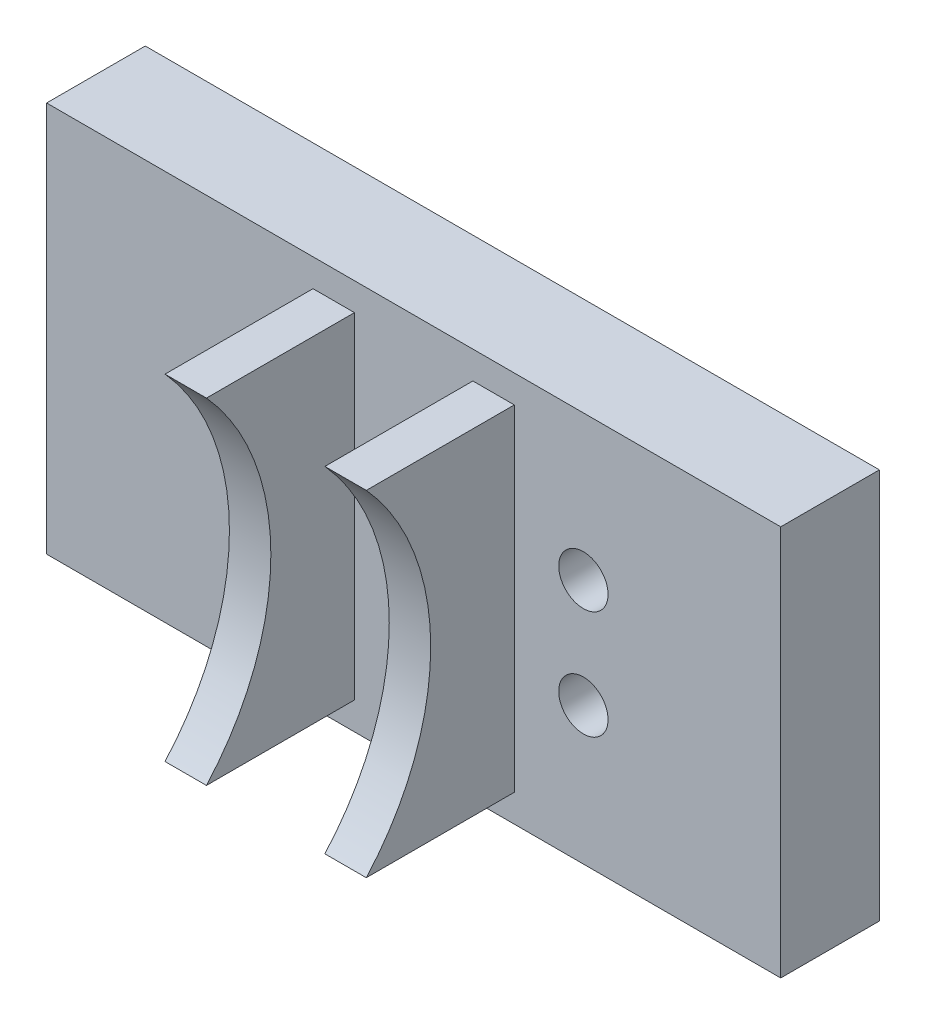
ISO-10303-21;
HEADER;
FILE_DESCRIPTION(('STEP AP214'),'2;1');
FILE_NAME('part.step','',(''),(''),'','','');
FILE_SCHEMA(('AUTOMOTIVE_DESIGN { 1 0 10303 214 1 1 1 1 }'));
ENDSEC;
DATA;
#1=APPLICATION_CONTEXT('core data for automotive mechanical design processes');
#2=APPLICATION_PROTOCOL_DEFINITION('international standard','automotive_design',2000,#1);
#3=PRODUCT_CONTEXT('',#1,'mechanical');
#4=PRODUCT('Part','Part','',(#3));
#5=PRODUCT_RELATED_PRODUCT_CATEGORY('part','',(#4));
#6=PRODUCT_DEFINITION_FORMATION('','',#4);
#7=PRODUCT_DEFINITION_CONTEXT('part definition',#1,'design');
#8=PRODUCT_DEFINITION('design','',#6,#7);
#9=PRODUCT_DEFINITION_SHAPE('','',#8);
#10=(LENGTH_UNIT() NAMED_UNIT(*) SI_UNIT(.MILLI.,.METRE.));
#11=(NAMED_UNIT(*) PLANE_ANGLE_UNIT() SI_UNIT($,.RADIAN.));
#12=(NAMED_UNIT(*) SI_UNIT($,.STERADIAN.) SOLID_ANGLE_UNIT());
#13=UNCERTAINTY_MEASURE_WITH_UNIT(LENGTH_MEASURE(1.E-05),#10,'distance_accuracy_value','');
#14=(GEOMETRIC_REPRESENTATION_CONTEXT(3) GLOBAL_UNCERTAINTY_ASSIGNED_CONTEXT((#13)) GLOBAL_UNIT_ASSIGNED_CONTEXT((#10,
#11,#12)) REPRESENTATION_CONTEXT('',''));
#15=CARTESIAN_POINT('',(0.,0.,0.));
#16=DIRECTION('',(0.,0.,1.));
#17=DIRECTION('',(1.,0.,0.));
#18=AXIS2_PLACEMENT_3D('',#15,#16,#17);
#19=CARTESIAN_POINT('',(-69.9912890625,-22.80271484375,25.));
#20=DIRECTION('',(1.,0.,0.));
#21=DIRECTION('',(0.,0.,-1.));
#22=AXIS2_PLACEMENT_3D('',#19,#20,#21);
#23=PLANE('',#22);
#24=CARTESIAN_POINT('',(-69.9912890625,-5.80271484375,43.8722017793367));
#25=DIRECTION('',(1.,0.,0.));
#26=DIRECTION('',(0.,0.,-1.));
#27=AXIS2_PLACEMENT_3D('',#24,#25,#26);
#28=CIRCLE('',#27,25.4);
#29=CARTESIAN_POINT('',(-69.9912890625,11.19728515625,25.));
#30=VERTEX_POINT('',#29);
#31=CARTESIAN_POINT('',(-69.9912890625,-22.80271484375,25.));
#32=VERTEX_POINT('',#31);
#33=EDGE_CURVE('E137',#30,#32,#28,.F.);
#34=ORIENTED_EDGE('',*,*,#33,.F.);
#35=DIRECTION('',(0.,0.,-1.));
#36=VECTOR('',#35,1.);
#37=CARTESIAN_POINT('',(-69.9912890625,11.19728515625,25.));
#38=LINE('',#37,#36);
#39=CARTESIAN_POINT('',(-69.9912890625,11.19728515625,10.));
#40=VERTEX_POINT('',#39);
#41=EDGE_CURVE('E123',#30,#40,#38,.T.);
#42=ORIENTED_EDGE('',*,*,#41,.T.);
#43=DIRECTION('',(0.,-1.,0.));
#44=VECTOR('',#43,1.);
#45=CARTESIAN_POINT('',(-69.9912890625,-22.80271484375,10.));
#46=LINE('',#45,#44);
#47=CARTESIAN_POINT('',(-69.9912890625,-22.80271484375,10.));
#48=VERTEX_POINT('',#47);
#49=EDGE_CURVE('E151',#40,#48,#46,.T.);
#50=ORIENTED_EDGE('',*,*,#49,.T.);
#51=DIRECTION('',(0.,0.,-1.));
#52=VECTOR('',#51,1.);
#53=CARTESIAN_POINT('',(-69.9912890625,-22.80271484375,25.));
#54=LINE('',#53,#52);
#55=EDGE_CURVE('E139',#32,#48,#54,.T.);
#56=ORIENTED_EDGE('',*,*,#55,.F.);
#57=EDGE_LOOP('',(#34,#42,#50,#56));
#58=FACE_BOUND('',#57,.T.);
#59=ADVANCED_FACE('F33',(#58),#23,.F.);
#60=CARTESIAN_POINT('',(-65.7912890625,-22.80271484375,25.));
#61=DIRECTION('',(-1.,0.,0.));
#62=DIRECTION('',(0.,0.,1.));
#63=AXIS2_PLACEMENT_3D('',#60,#61,#62);
#64=PLANE('',#63);
#65=CARTESIAN_POINT('',(-65.7912890625,-5.80271484375,43.8722017793367));
#66=DIRECTION('',(-1.,0.,0.));
#67=DIRECTION('',(0.,0.,1.));
#68=AXIS2_PLACEMENT_3D('',#65,#66,#67);
#69=CIRCLE('',#68,25.4);
#70=CARTESIAN_POINT('',(-65.7912890625,11.19728515625,25.));
#71=VERTEX_POINT('',#70);
#72=CARTESIAN_POINT('',(-65.7912890625,-22.80271484375,25.));
#73=VERTEX_POINT('',#72);
#74=EDGE_CURVE('E143',#71,#73,#69,.T.);
#75=ORIENTED_EDGE('',*,*,#74,.T.);
#76=DIRECTION('',(0.,0.,-1.));
#77=VECTOR('',#76,1.);
#78=CARTESIAN_POINT('',(-65.7912890625,-22.80271484375,25.));
#79=LINE('',#78,#77);
#80=CARTESIAN_POINT('',(-65.7912890625,-22.80271484375,10.));
#81=VERTEX_POINT('',#80);
#82=EDGE_CURVE('E162',#73,#81,#79,.T.);
#83=ORIENTED_EDGE('',*,*,#82,.T.);
#84=DIRECTION('',(0.,1.,0.));
#85=VECTOR('',#84,1.);
#86=CARTESIAN_POINT('',(-65.7912890625,-22.80271484375,10.));
#87=LINE('',#86,#85);
#88=CARTESIAN_POINT('',(-65.7912890625,11.19728515625,10.));
#89=VERTEX_POINT('',#88);
#90=EDGE_CURVE('E157',#81,#89,#87,.T.);
#91=ORIENTED_EDGE('',*,*,#90,.T.);
#92=DIRECTION('',(0.,0.,-1.));
#93=VECTOR('',#92,1.);
#94=CARTESIAN_POINT('',(-65.7912890625,11.19728515625,25.));
#95=LINE('',#94,#93);
#96=EDGE_CURVE('E133',#71,#89,#95,.T.);
#97=ORIENTED_EDGE('',*,*,#96,.F.);
#98=EDGE_LOOP('',(#75,#83,#91,#97));
#99=FACE_BOUND('',#98,.T.);
#100=ADVANCED_FACE('F263',(#99),#64,.F.);
#101=CARTESIAN_POINT('',(0.,0.,10.));
#102=DIRECTION('',(0.,0.,-1.));
#103=DIRECTION('',(-1.,0.,0.));
#104=AXIS2_PLACEMENT_3D('',#101,#102,#103);
#105=PLANE('',#104);
#106=CARTESIAN_POINT('',(-76.0087125308004,-11.68271484375,10.));
#107=DIRECTION('',(0.,0.,1.));
#108=DIRECTION('',(1.,0.,0.));
#109=AXIS2_PLACEMENT_3D('',#106,#107,#108);
#110=CIRCLE('',#109,2.5);
#111=CARTESIAN_POINT('',(-73.5087125308004,-11.68271484375,10.));
#112=VERTEX_POINT('',#111);
#113=EDGE_CURVE('E387',#112,#112,#110,.T.);
#114=ORIENTED_EDGE('',*,*,#113,.F.);
#115=EDGE_LOOP('',(#114));
#116=FACE_BOUND('',#115,.T.);
#117=CARTESIAN_POINT('',(-42.5912890625,-0.682714843749998,10.));
#118=DIRECTION('',(0.,0.,1.));
#119=DIRECTION('',(1.,0.,0.));
#120=AXIS2_PLACEMENT_3D('',#117,#118,#119);
#121=CIRCLE('',#120,2.5);
#122=CARTESIAN_POINT('',(-40.0912890625,-0.682714843749998,10.));
#123=VERTEX_POINT('',#122);
#124=EDGE_CURVE('E388',#123,#123,#121,.T.);
#125=ORIENTED_EDGE('',*,*,#124,.F.);
#126=EDGE_LOOP('',(#125));
#127=FACE_BOUND('',#126,.T.);
#128=CARTESIAN_POINT('',(-76.0087125308004,-0.682714843749998,10.));
#129=DIRECTION('',(0.,0.,1.));
#130=DIRECTION('',(1.,0.,0.));
#131=AXIS2_PLACEMENT_3D('',#128,#129,#130);
#132=CIRCLE('',#131,2.5);
#133=CARTESIAN_POINT('',(-73.5087125308004,-0.682714843749998,10.));
#134=VERTEX_POINT('',#133);
#135=EDGE_CURVE('E390',#134,#134,#132,.T.);
#136=ORIENTED_EDGE('',*,*,#135,.F.);
#137=EDGE_LOOP('',(#136));
#138=FACE_BOUND('',#137,.T.);
#139=CARTESIAN_POINT('',(-42.5912890625,-11.68271484375,10.));
#140=DIRECTION('',(0.,0.,1.));
#141=DIRECTION('',(1.,0.,0.));
#142=AXIS2_PLACEMENT_3D('',#139,#140,#141);
#143=CIRCLE('',#142,2.5);
#144=CARTESIAN_POINT('',(-40.0912890625,-11.68271484375,10.));
#145=VERTEX_POINT('',#144);
#146=EDGE_CURVE('E196',#145,#145,#143,.T.);
#147=ORIENTED_EDGE('',*,*,#146,.F.);
#148=EDGE_LOOP('',(#147));
#149=FACE_BOUND('',#148,.T.);
#150=ORIENTED_EDGE('',*,*,#49,.F.);
#151=DIRECTION('',(-1.,0.,0.));
#152=VECTOR('',#151,1.);
#153=CARTESIAN_POINT('',(-69.9912890625,11.19728515625,10.));
#154=LINE('',#153,#152);
#155=EDGE_CURVE('E130',#89,#40,#154,.T.);
#156=ORIENTED_EDGE('',*,*,#155,.F.);
#157=ORIENTED_EDGE('',*,*,#90,.F.);
#158=DIRECTION('',(1.,0.,0.));
#159=VECTOR('',#158,1.);
#160=CARTESIAN_POINT('',(-69.9912890625,-22.80271484375,10.));
#161=LINE('',#160,#159);
#162=EDGE_CURVE('E153',#48,#81,#161,.T.);
#163=ORIENTED_EDGE('',*,*,#162,.F.);
#164=EDGE_LOOP('',(#150,#156,#157,#163));
#165=FACE_BOUND('',#164,.T.);
#166=DIRECTION('',(0.,1.,0.));
#167=VECTOR('',#166,1.);
#168=CARTESIAN_POINT('',(-22.5912890625,13.99728515625,10.));
#169=LINE('',#168,#167);
#170=CARTESIAN_POINT('',(-22.5912890625,-25.60271484375,10.));
#171=VERTEX_POINT('',#170);
#172=CARTESIAN_POINT('',(-22.5912890625,13.99728515625,10.));
#173=VERTEX_POINT('',#172);
#174=EDGE_CURVE('E167',#171,#173,#169,.T.);
#175=ORIENTED_EDGE('',*,*,#174,.T.);
#176=DIRECTION('',(-1.,0.,0.));
#177=VECTOR('',#176,1.);
#178=CARTESIAN_POINT('',(-22.5912890625,13.99728515625,10.));
#179=LINE('',#178,#177);
#180=CARTESIAN_POINT('',(-96.9912890625,13.99728515625,10.));
#181=VERTEX_POINT('',#180);
#182=EDGE_CURVE('E170',#173,#181,#179,.T.);
#183=ORIENTED_EDGE('',*,*,#182,.T.);
#184=DIRECTION('',(0.,-1.,0.));
#185=VECTOR('',#184,1.);
#186=CARTESIAN_POINT('',(-96.9912890625,13.99728515625,10.));
#187=LINE('',#186,#185);
#188=CARTESIAN_POINT('',(-96.9912890625,-25.60271484375,10.));
#189=VERTEX_POINT('',#188);
#190=EDGE_CURVE('E173',#181,#189,#187,.T.);
#191=ORIENTED_EDGE('',*,*,#190,.T.);
#192=DIRECTION('',(1.,0.,0.));
#193=VECTOR('',#192,1.);
#194=CARTESIAN_POINT('',(-22.5912890625,-25.60271484375,10.));
#195=LINE('',#194,#193);
#196=EDGE_CURVE('E175',#189,#171,#195,.T.);
#197=ORIENTED_EDGE('',*,*,#196,.T.);
#198=EDGE_LOOP('',(#175,#183,#191,#197));
#199=FACE_BOUND('',#198,.T.);
#200=DIRECTION('',(0.,1.,0.));
#201=VECTOR('',#200,1.);
#202=CARTESIAN_POINT('',(-49.5912890625,11.19728515625,10.));
#203=LINE('',#202,#201);
#204=CARTESIAN_POINT('',(-49.5912890625,-22.80271484375,10.));
#205=VERTEX_POINT('',#204);
#206=CARTESIAN_POINT('',(-49.5912890625,11.19728515625,10.));
#207=VERTEX_POINT('',#206);
#208=EDGE_CURVE('E216',#205,#207,#203,.T.);
#209=ORIENTED_EDGE('',*,*,#208,.F.);
#210=DIRECTION('',(1.,0.,0.));
#211=VECTOR('',#210,1.);
#212=CARTESIAN_POINT('',(-49.5912890625,-22.80271484375,10.));
#213=LINE('',#212,#211);
#214=CARTESIAN_POINT('',(-53.7912890625,-22.80271484375,10.));
#215=VERTEX_POINT('',#214);
#216=EDGE_CURVE('E221',#215,#205,#213,.T.);
#217=ORIENTED_EDGE('',*,*,#216,.F.);
#218=DIRECTION('',(0.,-1.,0.));
#219=VECTOR('',#218,1.);
#220=CARTESIAN_POINT('',(-53.7912890625,11.19728515625,10.));
#221=LINE('',#220,#219);
#222=CARTESIAN_POINT('',(-53.7912890625,11.19728515625,10.));
#223=VERTEX_POINT('',#222);
#224=EDGE_CURVE('E55',#223,#215,#221,.T.);
#225=ORIENTED_EDGE('',*,*,#224,.F.);
#226=DIRECTION('',(-1.,0.,0.));
#227=VECTOR('',#226,1.);
#228=CARTESIAN_POINT('',(-49.5912890625,11.19728515625,10.));
#229=LINE('',#228,#227);
#230=EDGE_CURVE('E50',#207,#223,#229,.T.);
#231=ORIENTED_EDGE('',*,*,#230,.F.);
#232=EDGE_LOOP('',(#209,#217,#225,#231));
#233=FACE_BOUND('',#232,.T.);
#234=ADVANCED_FACE('F244',(#116,#127,#138,#149,#165,#199,#233),#105,.F.);
#235=CARTESIAN_POINT('',(-22.5912890625,13.99728515625,10.));
#236=DIRECTION('',(-1.,0.,0.));
#237=DIRECTION('',(0.,-1.,0.));
#238=AXIS2_PLACEMENT_3D('',#235,#236,#237);
#239=PLANE('',#238);
#240=DIRECTION('',(0.,1.,0.));
#241=VECTOR('',#240,1.);
#242=CARTESIAN_POINT('',(-22.5912890625,13.99728515625,0.));
#243=LINE('',#242,#241);
#244=CARTESIAN_POINT('',(-22.5912890625,-25.60271484375,0.));
#245=VERTEX_POINT('',#244);
#246=CARTESIAN_POINT('',(-22.5912890625,13.99728515625,0.));
#247=VERTEX_POINT('',#246);
#248=EDGE_CURVE('E166',#245,#247,#243,.T.);
#249=ORIENTED_EDGE('',*,*,#248,.T.);
#250=DIRECTION('',(0.,0.,-1.));
#251=VECTOR('',#250,1.);
#252=CARTESIAN_POINT('',(-22.5912890625,13.99728515625,10.));
#253=LINE('',#252,#251);
#254=EDGE_CURVE('E11',#173,#247,#253,.T.);
#255=ORIENTED_EDGE('',*,*,#254,.F.);
#256=ORIENTED_EDGE('',*,*,#174,.F.);
#257=DIRECTION('',(0.,0.,-1.));
#258=VECTOR('',#257,1.);
#259=CARTESIAN_POINT('',(-22.5912890625,-25.60271484375,10.));
#260=LINE('',#259,#258);
#261=EDGE_CURVE('E177',#171,#245,#260,.T.);
#262=ORIENTED_EDGE('',*,*,#261,.T.);
#263=EDGE_LOOP('',(#249,#255,#256,#262));
#264=FACE_BOUND('',#263,.T.);
#265=ADVANCED_FACE('F35',(#264),#239,.F.);
#266=CARTESIAN_POINT('',(-22.5912890625,13.99728515625,10.));
#267=DIRECTION('',(0.,-1.,0.));
#268=DIRECTION('',(1.,0.,0.));
#269=AXIS2_PLACEMENT_3D('',#266,#267,#268);
#270=PLANE('',#269);
#271=DIRECTION('',(-1.,0.,0.));
#272=VECTOR('',#271,1.);
#273=CARTESIAN_POINT('',(-22.5912890625,13.99728515625,0.));
#274=LINE('',#273,#272);
#275=CARTESIAN_POINT('',(-96.9912890625,13.99728515625,0.));
#276=VERTEX_POINT('',#275);
#277=EDGE_CURVE('E180',#247,#276,#274,.T.);
#278=ORIENTED_EDGE('',*,*,#277,.T.);
#279=DIRECTION('',(0.,0.,-1.));
#280=VECTOR('',#279,1.);
#281=CARTESIAN_POINT('',(-96.9912890625,13.99728515625,10.));
#282=LINE('',#281,#280);
#283=EDGE_CURVE('E42',#181,#276,#282,.T.);
#284=ORIENTED_EDGE('',*,*,#283,.F.);
#285=ORIENTED_EDGE('',*,*,#182,.F.);
#286=ORIENTED_EDGE('',*,*,#254,.T.);
#287=EDGE_LOOP('',(#278,#284,#285,#286));
#288=FACE_BOUND('',#287,.T.);
#289=ADVANCED_FACE('F285',(#288),#270,.F.);
#290=CARTESIAN_POINT('',(-96.9912890625,13.99728515625,10.));
#291=DIRECTION('',(1.,0.,0.));
#292=DIRECTION('',(0.,0.,-1.));
#293=AXIS2_PLACEMENT_3D('',#290,#291,#292);
#294=PLANE('',#293);
#295=DIRECTION('',(0.,-1.,0.));
#296=VECTOR('',#295,1.);
#297=CARTESIAN_POINT('',(-96.9912890625,13.99728515625,0.));
#298=LINE('',#297,#296);
#299=CARTESIAN_POINT('',(-96.9912890625,-25.60271484375,0.));
#300=VERTEX_POINT('',#299);
#301=EDGE_CURVE('E182',#276,#300,#298,.T.);
#302=ORIENTED_EDGE('',*,*,#301,.T.);
#303=DIRECTION('',(0.,0.,-1.));
#304=VECTOR('',#303,1.);
#305=CARTESIAN_POINT('',(-96.9912890625,-25.60271484375,10.));
#306=LINE('',#305,#304);
#307=EDGE_CURVE('E187',#189,#300,#306,.T.);
#308=ORIENTED_EDGE('',*,*,#307,.F.);
#309=ORIENTED_EDGE('',*,*,#190,.F.);
#310=ORIENTED_EDGE('',*,*,#283,.T.);
#311=EDGE_LOOP('',(#302,#308,#309,#310));
#312=FACE_BOUND('',#311,.T.);
#313=ADVANCED_FACE('F282',(#312),#294,.F.);
#314=CARTESIAN_POINT('',(-22.5912890625,-25.60271484375,10.));
#315=DIRECTION('',(0.,1.,0.));
#316=DIRECTION('',(-1.,0.,0.));
#317=AXIS2_PLACEMENT_3D('',#314,#315,#316);
#318=PLANE('',#317);
#319=DIRECTION('',(1.,0.,0.));
#320=VECTOR('',#319,1.);
#321=CARTESIAN_POINT('',(-22.5912890625,-25.60271484375,0.));
#322=LINE('',#321,#320);
#323=EDGE_CURVE('E171',#300,#245,#322,.T.);
#324=ORIENTED_EDGE('',*,*,#323,.T.);
#325=ORIENTED_EDGE('',*,*,#261,.F.);
#326=ORIENTED_EDGE('',*,*,#196,.F.);
#327=ORIENTED_EDGE('',*,*,#307,.T.);
#328=EDGE_LOOP('',(#324,#325,#326,#327));
#329=FACE_BOUND('',#328,.T.);
#330=ADVANCED_FACE('F278',(#329),#318,.F.);
#331=CARTESIAN_POINT('',(0.,0.,0.));
#332=DIRECTION('',(0.,0.,-1.));
#333=DIRECTION('',(-1.,0.,0.));
#334=AXIS2_PLACEMENT_3D('',#331,#332,#333);
#335=PLANE('',#334);
#336=CARTESIAN_POINT('',(-76.0087125308004,-11.68271484375,0.));
#337=DIRECTION('',(0.,0.,-1.));
#338=DIRECTION('',(-1.,0.,0.));
#339=AXIS2_PLACEMENT_3D('',#336,#337,#338);
#340=CIRCLE('',#339,2.5);
#341=CARTESIAN_POINT('',(-78.5087125308004,-11.68271484375,0.));
#342=VERTEX_POINT('',#341);
#343=EDGE_CURVE('E37',#342,#342,#340,.T.);
#344=ORIENTED_EDGE('',*,*,#343,.F.);
#345=EDGE_LOOP('',(#344));
#346=FACE_BOUND('',#345,.T.);
#347=CARTESIAN_POINT('',(-42.5912890625,-0.682714843749998,0.));
#348=DIRECTION('',(0.,0.,-1.));
#349=DIRECTION('',(-1.,0.,0.));
#350=AXIS2_PLACEMENT_3D('',#347,#348,#349);
#351=CIRCLE('',#350,2.5);
#352=CARTESIAN_POINT('',(-45.0912890625,-0.682714843749998,0.));
#353=VERTEX_POINT('',#352);
#354=EDGE_CURVE('E198',#353,#353,#351,.T.);
#355=ORIENTED_EDGE('',*,*,#354,.F.);
#356=EDGE_LOOP('',(#355));
#357=FACE_BOUND('',#356,.T.);
#358=CARTESIAN_POINT('',(-76.0087125308004,-0.682714843749998,0.));
#359=DIRECTION('',(0.,0.,-1.));
#360=DIRECTION('',(-1.,0.,0.));
#361=AXIS2_PLACEMENT_3D('',#358,#359,#360);
#362=CIRCLE('',#361,2.5);
#363=CARTESIAN_POINT('',(-78.5087125308004,-0.682714843749998,0.));
#364=VERTEX_POINT('',#363);
#365=EDGE_CURVE('E195',#364,#364,#362,.T.);
#366=ORIENTED_EDGE('',*,*,#365,.F.);
#367=EDGE_LOOP('',(#366));
#368=FACE_BOUND('',#367,.T.);
#369=CARTESIAN_POINT('',(-42.5912890625,-11.68271484375,0.));
#370=DIRECTION('',(0.,0.,-1.));
#371=DIRECTION('',(-1.,0.,0.));
#372=AXIS2_PLACEMENT_3D('',#369,#370,#371);
#373=CIRCLE('',#372,2.5);
#374=CARTESIAN_POINT('',(-45.0912890625,-11.68271484375,0.));
#375=VERTEX_POINT('',#374);
#376=EDGE_CURVE('E192',#375,#375,#373,.T.);
#377=ORIENTED_EDGE('',*,*,#376,.F.);
#378=EDGE_LOOP('',(#377));
#379=FACE_BOUND('',#378,.T.);
#380=ORIENTED_EDGE('',*,*,#248,.F.);
#381=ORIENTED_EDGE('',*,*,#323,.F.);
#382=ORIENTED_EDGE('',*,*,#301,.F.);
#383=ORIENTED_EDGE('',*,*,#277,.F.);
#384=EDGE_LOOP('',(#380,#381,#382,#383));
#385=FACE_BOUND('',#384,.T.);
#386=ADVANCED_FACE('F275',(#346,#357,#368,#379,#385),#335,.T.);
#387=CARTESIAN_POINT('',(-69.9912890625,-22.80271484375,25.));
#388=DIRECTION('',(0.,1.,0.));
#389=DIRECTION('',(0.,0.,1.));
#390=AXIS2_PLACEMENT_3D('',#387,#388,#389);
#391=PLANE('',#390);
#392=ORIENTED_EDGE('',*,*,#162,.T.);
#393=ORIENTED_EDGE('',*,*,#82,.F.);
#394=DIRECTION('',(1.,0.,0.));
#395=VECTOR('',#394,1.);
#396=CARTESIAN_POINT('',(-69.9912890625,-22.80271484375,25.));
#397=LINE('',#396,#395);
#398=EDGE_CURVE('E146',#32,#73,#397,.T.);
#399=ORIENTED_EDGE('',*,*,#398,.F.);
#400=ORIENTED_EDGE('',*,*,#55,.T.);
#401=EDGE_LOOP('',(#392,#393,#399,#400));
#402=FACE_BOUND('',#401,.T.);
#403=ADVANCED_FACE('F271',(#402),#391,.F.);
#404=CARTESIAN_POINT('',(-69.9912890625,11.19728515625,25.));
#405=DIRECTION('',(0.,-1.,0.));
#406=DIRECTION('',(0.,0.,-1.));
#407=AXIS2_PLACEMENT_3D('',#404,#405,#406);
#408=PLANE('',#407);
#409=ORIENTED_EDGE('',*,*,#155,.T.);
#410=ORIENTED_EDGE('',*,*,#41,.F.);
#411=DIRECTION('',(-1.,0.,0.));
#412=VECTOR('',#411,1.);
#413=CARTESIAN_POINT('',(-69.9912890625,11.19728515625,25.));
#414=LINE('',#413,#412);
#415=EDGE_CURVE('E128',#71,#30,#414,.T.);
#416=ORIENTED_EDGE('',*,*,#415,.F.);
#417=ORIENTED_EDGE('',*,*,#96,.T.);
#418=EDGE_LOOP('',(#409,#410,#416,#417));
#419=FACE_BOUND('',#418,.T.);
#420=ADVANCED_FACE('F125',(#419),#408,.F.);
#421=CARTESIAN_POINT('',(-49.5912890625,11.19728515625,25.));
#422=DIRECTION('',(-1.,0.,0.));
#423=DIRECTION('',(0.,-1.,0.));
#424=AXIS2_PLACEMENT_3D('',#421,#422,#423);
#425=PLANE('',#424);
#426=DIRECTION('',(0.,0.,-1.));
#427=VECTOR('',#426,1.);
#428=CARTESIAN_POINT('',(-49.5912890625,11.19728515625,25.));
#429=LINE('',#428,#427);
#430=CARTESIAN_POINT('',(-49.5912890625,11.19728515625,25.));
#431=VERTEX_POINT('',#430);
#432=EDGE_CURVE('E154',#431,#207,#429,.T.);
#433=ORIENTED_EDGE('',*,*,#432,.F.);
#434=CARTESIAN_POINT('',(-49.5912890625,-5.80271484375,43.8722017793367));
#435=DIRECTION('',(-1.,0.,0.));
#436=DIRECTION('',(0.,-1.,0.));
#437=AXIS2_PLACEMENT_3D('',#434,#435,#436);
#438=CIRCLE('',#437,25.4);
#439=CARTESIAN_POINT('',(-49.5912890625,-22.80271484375,25.));
#440=VERTEX_POINT('',#439);
#441=EDGE_CURVE('E142',#440,#431,#438,.F.);
#442=ORIENTED_EDGE('',*,*,#441,.F.);
#443=DIRECTION('',(0.,0.,-1.));
#444=VECTOR('',#443,1.);
#445=CARTESIAN_POINT('',(-49.5912890625,-22.80271484375,25.));
#446=LINE('',#445,#444);
#447=EDGE_CURVE('E224',#440,#205,#446,.T.);
#448=ORIENTED_EDGE('',*,*,#447,.T.);
#449=ORIENTED_EDGE('',*,*,#208,.T.);
#450=EDGE_LOOP('',(#433,#442,#448,#449));
#451=FACE_BOUND('',#450,.T.);
#452=ADVANCED_FACE('F242',(#451),#425,.F.);
#453=CARTESIAN_POINT('',(-49.5912890625,11.19728515625,25.));
#454=DIRECTION('',(0.,-1.,0.));
#455=DIRECTION('',(0.,0.,-1.));
#456=AXIS2_PLACEMENT_3D('',#453,#454,#455);
#457=PLANE('',#456);
#458=ORIENTED_EDGE('',*,*,#230,.T.);
#459=DIRECTION('',(0.,0.,-1.));
#460=VECTOR('',#459,1.);
#461=CARTESIAN_POINT('',(-53.7912890625,11.19728515625,25.));
#462=LINE('',#461,#460);
#463=CARTESIAN_POINT('',(-53.7912890625,11.19728515625,25.));
#464=VERTEX_POINT('',#463);
#465=EDGE_CURVE('E236',#464,#223,#462,.T.);
#466=ORIENTED_EDGE('',*,*,#465,.F.);
#467=DIRECTION('',(-1.,0.,0.));
#468=VECTOR('',#467,1.);
#469=CARTESIAN_POINT('',(-49.5912890625,11.19728515625,25.));
#470=LINE('',#469,#468);
#471=EDGE_CURVE('E217',#431,#464,#470,.T.);
#472=ORIENTED_EDGE('',*,*,#471,.F.);
#473=ORIENTED_EDGE('',*,*,#432,.T.);
#474=EDGE_LOOP('',(#458,#466,#472,#473));
#475=FACE_BOUND('',#474,.T.);
#476=ADVANCED_FACE('F240',(#475),#457,.F.);
#477=CARTESIAN_POINT('',(-53.7912890625,11.19728515625,25.));
#478=DIRECTION('',(1.,0.,0.));
#479=DIRECTION('',(0.,1.,0.));
#480=AXIS2_PLACEMENT_3D('',#477,#478,#479);
#481=PLANE('',#480);
#482=DIRECTION('',(0.,0.,-1.));
#483=VECTOR('',#482,1.);
#484=CARTESIAN_POINT('',(-53.7912890625,-22.80271484375,25.));
#485=LINE('',#484,#483);
#486=CARTESIAN_POINT('',(-53.7912890625,-22.80271484375,25.));
#487=VERTEX_POINT('',#486);
#488=EDGE_CURVE('E233',#487,#215,#485,.T.);
#489=ORIENTED_EDGE('',*,*,#488,.F.);
#490=CARTESIAN_POINT('',(-53.7912890625,-5.80271484375,43.8722017793367));
#491=DIRECTION('',(1.,0.,0.));
#492=DIRECTION('',(0.,1.,0.));
#493=AXIS2_PLACEMENT_3D('',#490,#491,#492);
#494=CIRCLE('',#493,25.4);
#495=EDGE_CURVE('E213',#487,#464,#494,.T.);
#496=ORIENTED_EDGE('',*,*,#495,.T.);
#497=ORIENTED_EDGE('',*,*,#465,.T.);
#498=ORIENTED_EDGE('',*,*,#224,.T.);
#499=EDGE_LOOP('',(#489,#496,#497,#498));
#500=FACE_BOUND('',#499,.T.);
#501=ADVANCED_FACE('F250',(#500),#481,.F.);
#502=CARTESIAN_POINT('',(-49.5912890625,-22.80271484375,25.));
#503=DIRECTION('',(0.,1.,0.));
#504=DIRECTION('',(0.,0.,1.));
#505=AXIS2_PLACEMENT_3D('',#502,#503,#504);
#506=PLANE('',#505);
#507=ORIENTED_EDGE('',*,*,#216,.T.);
#508=ORIENTED_EDGE('',*,*,#447,.F.);
#509=DIRECTION('',(1.,0.,0.));
#510=VECTOR('',#509,1.);
#511=CARTESIAN_POINT('',(-49.5912890625,-22.80271484375,25.));
#512=LINE('',#511,#510);
#513=EDGE_CURVE('E220',#487,#440,#512,.T.);
#514=ORIENTED_EDGE('',*,*,#513,.F.);
#515=ORIENTED_EDGE('',*,*,#488,.T.);
#516=EDGE_LOOP('',(#507,#508,#514,#515));
#517=FACE_BOUND('',#516,.T.);
#518=ADVANCED_FACE('F246',(#517),#506,.F.);
#519=CARTESIAN_POINT('',(94.0487127575018,-5.80271484374997,43.8722017793367));
#520=DIRECTION('',(-1.,0.,0.));
#521=DIRECTION('',(0.,-1.,0.));
#522=AXIS2_PLACEMENT_3D('',#519,#520,#521);
#523=CYLINDRICAL_SURFACE('',#522,25.4);
#524=ORIENTED_EDGE('',*,*,#495,.F.);
#525=ORIENTED_EDGE('',*,*,#513,.T.);
#526=ORIENTED_EDGE('',*,*,#441,.T.);
#527=ORIENTED_EDGE('',*,*,#471,.T.);
#528=EDGE_LOOP('',(#524,#525,#526,#527));
#529=FACE_BOUND('',#528,.T.);
#530=ADVANCED_FACE('F252',(#529),#523,.F.);
#531=CARTESIAN_POINT('',(98.0987127575019,-5.80271484375,43.8722017793367));
#532=DIRECTION('',(-1.,0.,0.));
#533=DIRECTION('',(0.,0.,1.));
#534=AXIS2_PLACEMENT_3D('',#531,#532,#533);
#535=CYLINDRICAL_SURFACE('',#534,25.4);
#536=ORIENTED_EDGE('',*,*,#415,.T.);
#537=ORIENTED_EDGE('',*,*,#33,.T.);
#538=ORIENTED_EDGE('',*,*,#398,.T.);
#539=ORIENTED_EDGE('',*,*,#74,.F.);
#540=EDGE_LOOP('',(#536,#537,#538,#539));
#541=FACE_BOUND('',#540,.T.);
#542=ADVANCED_FACE('F145',(#541),#535,.F.);
#543=CARTESIAN_POINT('',(-42.5912890625,-11.68271484375,-5.));
#544=DIRECTION('',(0.,0.,1.));
#545=DIRECTION('',(1.,0.,0.));
#546=AXIS2_PLACEMENT_3D('',#543,#544,#545);
#547=CYLINDRICAL_SURFACE('',#546,2.5);
#548=ORIENTED_EDGE('',*,*,#376,.T.);
#549=EDGE_LOOP('',(#548));
#550=FACE_BOUND('',#549,.T.);
#551=ORIENTED_EDGE('',*,*,#146,.T.);
#552=EDGE_LOOP('',(#551));
#553=FACE_BOUND('',#552,.T.);
#554=ADVANCED_FACE('F259',(#550,#553),#547,.F.);
#555=CARTESIAN_POINT('',(-76.0087125308004,-0.682714843749998,-5.));
#556=DIRECTION('',(0.,0.,1.));
#557=DIRECTION('',(1.,0.,0.));
#558=AXIS2_PLACEMENT_3D('',#555,#556,#557);
#559=CYLINDRICAL_SURFACE('',#558,2.5);
#560=ORIENTED_EDGE('',*,*,#365,.T.);
#561=EDGE_LOOP('',(#560));
#562=FACE_BOUND('',#561,.T.);
#563=ORIENTED_EDGE('',*,*,#135,.T.);
#564=EDGE_LOOP('',(#563));
#565=FACE_BOUND('',#564,.T.);
#566=ADVANCED_FACE('F352',(#562,#565),#559,.F.);
#567=CARTESIAN_POINT('',(-42.5912890625,-0.682714843749998,-5.));
#568=DIRECTION('',(0.,0.,1.));
#569=DIRECTION('',(1.,0.,0.));
#570=AXIS2_PLACEMENT_3D('',#567,#568,#569);
#571=CYLINDRICAL_SURFACE('',#570,2.5);
#572=ORIENTED_EDGE('',*,*,#354,.T.);
#573=EDGE_LOOP('',(#572));
#574=FACE_BOUND('',#573,.T.);
#575=ORIENTED_EDGE('',*,*,#124,.T.);
#576=EDGE_LOOP('',(#575));
#577=FACE_BOUND('',#576,.T.);
#578=ADVANCED_FACE('F359',(#574,#577),#571,.F.);
#579=CARTESIAN_POINT('',(-76.0087125308004,-11.68271484375,-5.));
#580=DIRECTION('',(0.,0.,1.));
#581=DIRECTION('',(1.,0.,0.));
#582=AXIS2_PLACEMENT_3D('',#579,#580,#581);
#583=CYLINDRICAL_SURFACE('',#582,2.5);
#584=ORIENTED_EDGE('',*,*,#343,.T.);
#585=EDGE_LOOP('',(#584));
#586=FACE_BOUND('',#585,.T.);
#587=ORIENTED_EDGE('',*,*,#113,.T.);
#588=EDGE_LOOP('',(#587));
#589=FACE_BOUND('',#588,.T.);
#590=ADVANCED_FACE('F367',(#586,#589),#583,.F.);
#591=CLOSED_SHELL('',(#59,#100,#234,#265,#289,#313,#330,#386,#403,#420,#452,#476,#501,#518,#530,
#542,#554,#566,#578,#590));
#592=MANIFOLD_SOLID_BREP('B2',#591);
#593=ADVANCED_BREP_SHAPE_REPRESENTATION('',(#18,#592),#14);
#594=SHAPE_DEFINITION_REPRESENTATION(#9,#593);
ENDSEC;
END-ISO-10303-21;
